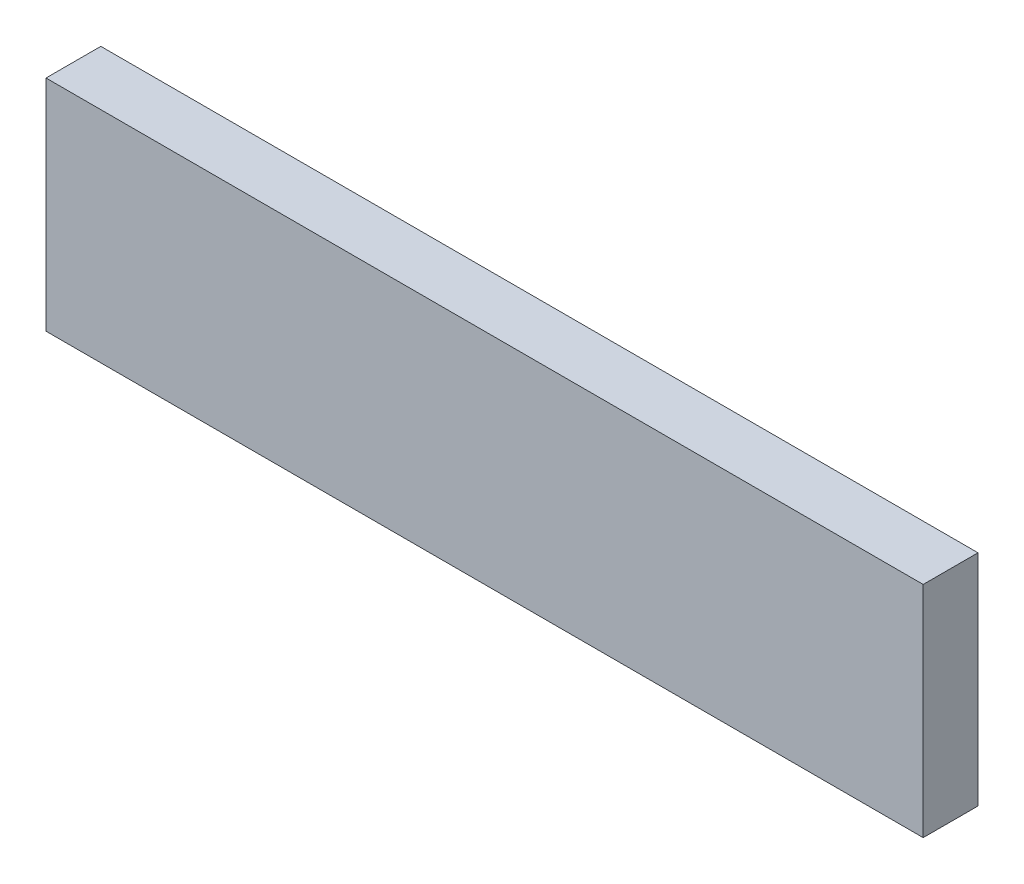
ISO-10303-21;
HEADER;
FILE_DESCRIPTION(('STEP AP214'),'2;1');
FILE_NAME('part.step','',(''),(''),'','','');
FILE_SCHEMA(('AUTOMOTIVE_DESIGN { 1 0 10303 214 1 1 1 1 }'));
ENDSEC;
DATA;
#1=APPLICATION_CONTEXT('core data for automotive mechanical design processes');
#2=APPLICATION_PROTOCOL_DEFINITION('international standard','automotive_design',2000,#1);
#3=PRODUCT_CONTEXT('',#1,'mechanical');
#4=PRODUCT('Part','Part','',(#3));
#5=PRODUCT_RELATED_PRODUCT_CATEGORY('part','',(#4));
#6=PRODUCT_DEFINITION_FORMATION('','',#4);
#7=PRODUCT_DEFINITION_CONTEXT('part definition',#1,'design');
#8=PRODUCT_DEFINITION('design','',#6,#7);
#9=PRODUCT_DEFINITION_SHAPE('','',#8);
#10=(LENGTH_UNIT() NAMED_UNIT(*) SI_UNIT(.MILLI.,.METRE.));
#11=(NAMED_UNIT(*) PLANE_ANGLE_UNIT() SI_UNIT($,.RADIAN.));
#12=(NAMED_UNIT(*) SI_UNIT($,.STERADIAN.) SOLID_ANGLE_UNIT());
#13=UNCERTAINTY_MEASURE_WITH_UNIT(LENGTH_MEASURE(1.E-05),#10,'distance_accuracy_value','');
#14=(GEOMETRIC_REPRESENTATION_CONTEXT(3) GLOBAL_UNCERTAINTY_ASSIGNED_CONTEXT((#13)) GLOBAL_UNIT_ASSIGNED_CONTEXT((#10,
#11,#12)) REPRESENTATION_CONTEXT('',''));
#15=CARTESIAN_POINT('',(0.,0.,0.));
#16=DIRECTION('',(0.,0.,1.));
#17=DIRECTION('',(1.,0.,0.));
#18=AXIS2_PLACEMENT_3D('',#15,#16,#17);
#19=CARTESIAN_POINT('',(0.,0.,2.5));
#20=DIRECTION('',(1.,0.,0.));
#21=DIRECTION('',(0.,0.,-1.));
#22=AXIS2_PLACEMENT_3D('',#19,#20,#21);
#23=PLANE('',#22);
#24=DIRECTION('',(0.,-1.,0.));
#25=VECTOR('',#24,1.);
#26=CARTESIAN_POINT('',(0.,0.,0.));
#27=LINE('',#26,#25);
#28=CARTESIAN_POINT('',(0.,10.,0.));
#29=VERTEX_POINT('',#28);
#30=CARTESIAN_POINT('',(0.,0.,0.));
#31=VERTEX_POINT('',#30);
#32=EDGE_CURVE('E113',#29,#31,#27,.T.);
#33=ORIENTED_EDGE('',*,*,#32,.T.);
#34=DIRECTION('',(0.,0.,-1.));
#35=VECTOR('',#34,1.);
#36=CARTESIAN_POINT('',(0.,0.,2.5));
#37=LINE('',#36,#35);
#38=CARTESIAN_POINT('',(0.,0.,2.5));
#39=VERTEX_POINT('',#38);
#40=EDGE_CURVE('E11',#39,#31,#37,.T.);
#41=ORIENTED_EDGE('',*,*,#40,.F.);
#42=DIRECTION('',(0.,-1.,0.));
#43=VECTOR('',#42,1.);
#44=CARTESIAN_POINT('',(0.,0.,2.5));
#45=LINE('',#44,#43);
#46=CARTESIAN_POINT('',(0.,10.,2.5));
#47=VERTEX_POINT('',#46);
#48=EDGE_CURVE('E97',#47,#39,#45,.T.);
#49=ORIENTED_EDGE('',*,*,#48,.F.);
#50=DIRECTION('',(0.,0.,-1.));
#51=VECTOR('',#50,1.);
#52=CARTESIAN_POINT('',(0.,10.,2.5));
#53=LINE('',#52,#51);
#54=EDGE_CURVE('E109',#47,#29,#53,.T.);
#55=ORIENTED_EDGE('',*,*,#54,.T.);
#56=EDGE_LOOP('',(#33,#41,#49,#55));
#57=FACE_BOUND('',#56,.T.);
#58=ADVANCED_FACE('F45',(#57),#23,.F.);
#59=CARTESIAN_POINT('',(0.,0.,2.5));
#60=DIRECTION('',(0.,1.,0.));
#61=DIRECTION('',(0.,0.,1.));
#62=AXIS2_PLACEMENT_3D('',#59,#60,#61);
#63=PLANE('',#62);
#64=DIRECTION('',(1.,0.,0.));
#65=VECTOR('',#64,1.);
#66=CARTESIAN_POINT('',(0.,0.,0.));
#67=LINE('',#66,#65);
#68=CARTESIAN_POINT('',(40.,0.,0.));
#69=VERTEX_POINT('',#68);
#70=EDGE_CURVE('E102',#31,#69,#67,.T.);
#71=ORIENTED_EDGE('',*,*,#70,.T.);
#72=DIRECTION('',(0.,0.,-1.));
#73=VECTOR('',#72,1.);
#74=CARTESIAN_POINT('',(40.,0.,2.5));
#75=LINE('',#74,#73);
#76=CARTESIAN_POINT('',(40.,0.,2.5));
#77=VERTEX_POINT('',#76);
#78=EDGE_CURVE('E54',#77,#69,#75,.T.);
#79=ORIENTED_EDGE('',*,*,#78,.F.);
#80=DIRECTION('',(1.,0.,0.));
#81=VECTOR('',#80,1.);
#82=CARTESIAN_POINT('',(0.,0.,2.5));
#83=LINE('',#82,#81);
#84=EDGE_CURVE('E92',#39,#77,#83,.T.);
#85=ORIENTED_EDGE('',*,*,#84,.F.);
#86=ORIENTED_EDGE('',*,*,#40,.T.);
#87=EDGE_LOOP('',(#71,#79,#85,#86));
#88=FACE_BOUND('',#87,.T.);
#89=ADVANCED_FACE('F101',(#88),#63,.F.);
#90=CARTESIAN_POINT('',(40.,0.,2.5));
#91=DIRECTION('',(-1.,0.,0.));
#92=DIRECTION('',(0.,0.,1.));
#93=AXIS2_PLACEMENT_3D('',#90,#91,#92);
#94=PLANE('',#93);
#95=DIRECTION('',(0.,1.,0.));
#96=VECTOR('',#95,1.);
#97=CARTESIAN_POINT('',(40.,0.,0.));
#98=LINE('',#97,#96);
#99=CARTESIAN_POINT('',(40.,10.,0.));
#100=VERTEX_POINT('',#99);
#101=EDGE_CURVE('E79',#69,#100,#98,.T.);
#102=ORIENTED_EDGE('',*,*,#101,.T.);
#103=DIRECTION('',(0.,0.,-1.));
#104=VECTOR('',#103,1.);
#105=CARTESIAN_POINT('',(40.,10.,2.5));
#106=LINE('',#105,#104);
#107=CARTESIAN_POINT('',(40.,10.,2.5));
#108=VERTEX_POINT('',#107);
#109=EDGE_CURVE('E104',#108,#100,#106,.T.);
#110=ORIENTED_EDGE('',*,*,#109,.F.);
#111=DIRECTION('',(0.,1.,0.));
#112=VECTOR('',#111,1.);
#113=CARTESIAN_POINT('',(40.,0.,2.5));
#114=LINE('',#113,#112);
#115=EDGE_CURVE('E95',#77,#108,#114,.T.);
#116=ORIENTED_EDGE('',*,*,#115,.F.);
#117=ORIENTED_EDGE('',*,*,#78,.T.);
#118=EDGE_LOOP('',(#102,#110,#116,#117));
#119=FACE_BOUND('',#118,.T.);
#120=ADVANCED_FACE('F105',(#119),#94,.F.);
#121=CARTESIAN_POINT('',(0.,10.,2.5));
#122=DIRECTION('',(0.,-1.,0.));
#123=DIRECTION('',(0.,0.,-1.));
#124=AXIS2_PLACEMENT_3D('',#121,#122,#123);
#125=PLANE('',#124);
#126=DIRECTION('',(-1.,0.,0.));
#127=VECTOR('',#126,1.);
#128=CARTESIAN_POINT('',(0.,10.,0.));
#129=LINE('',#128,#127);
#130=EDGE_CURVE('E85',#100,#29,#129,.T.);
#131=ORIENTED_EDGE('',*,*,#130,.T.);
#132=ORIENTED_EDGE('',*,*,#54,.F.);
#133=DIRECTION('',(-1.,0.,0.));
#134=VECTOR('',#133,1.);
#135=CARTESIAN_POINT('',(0.,10.,2.5));
#136=LINE('',#135,#134);
#137=EDGE_CURVE('E62',#108,#47,#136,.T.);
#138=ORIENTED_EDGE('',*,*,#137,.F.);
#139=ORIENTED_EDGE('',*,*,#109,.T.);
#140=EDGE_LOOP('',(#131,#132,#138,#139));
#141=FACE_BOUND('',#140,.T.);
#142=ADVANCED_FACE('F126',(#141),#125,.F.);
#143=CARTESIAN_POINT('',(0.,0.,2.5));
#144=DIRECTION('',(0.,0.,-1.));
#145=DIRECTION('',(-1.,0.,0.));
#146=AXIS2_PLACEMENT_3D('',#143,#144,#145);
#147=PLANE('',#146);
#148=ORIENTED_EDGE('',*,*,#48,.T.);
#149=ORIENTED_EDGE('',*,*,#84,.T.);
#150=ORIENTED_EDGE('',*,*,#115,.T.);
#151=ORIENTED_EDGE('',*,*,#137,.T.);
#152=EDGE_LOOP('',(#148,#149,#150,#151));
#153=FACE_BOUND('',#152,.T.);
#154=ADVANCED_FACE('F93',(#153),#147,.F.);
#155=CARTESIAN_POINT('',(0.,0.,0.));
#156=DIRECTION('',(0.,0.,-1.));
#157=DIRECTION('',(-1.,0.,0.));
#158=AXIS2_PLACEMENT_3D('',#155,#156,#157);
#159=PLANE('',#158);
#160=ORIENTED_EDGE('',*,*,#32,.F.);
#161=ORIENTED_EDGE('',*,*,#130,.F.);
#162=ORIENTED_EDGE('',*,*,#101,.F.);
#163=ORIENTED_EDGE('',*,*,#70,.F.);
#164=EDGE_LOOP('',(#160,#161,#162,#163));
#165=FACE_BOUND('',#164,.T.);
#166=ADVANCED_FACE('F129',(#165),#159,.T.);
#167=CLOSED_SHELL('',(#58,#89,#120,#142,#154,#166));
#168=MANIFOLD_SOLID_BREP('B2',#167);
#169=ADVANCED_BREP_SHAPE_REPRESENTATION('',(#18,#168),#14);
#170=SHAPE_DEFINITION_REPRESENTATION(#9,#169);
ENDSEC;
END-ISO-10303-21;
